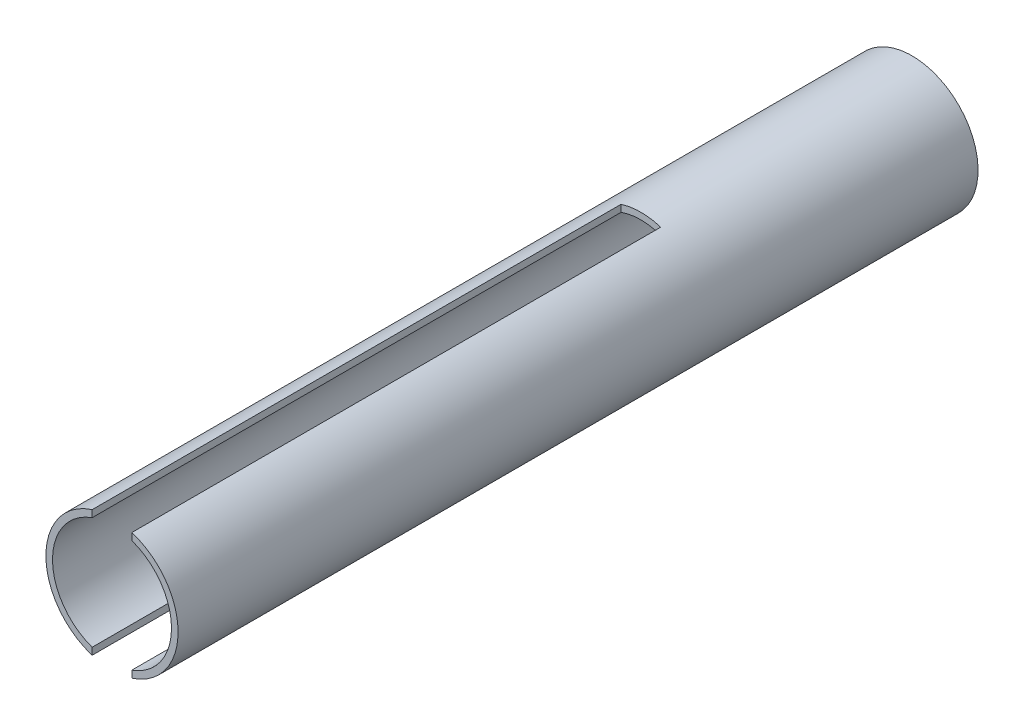
ISO-10303-21;
HEADER;
FILE_DESCRIPTION(('STEP AP214'),'2;1');
FILE_NAME('part.step','',(''),(''),'','','');
FILE_SCHEMA(('AUTOMOTIVE_DESIGN { 1 0 10303 214 1 1 1 1 }'));
ENDSEC;
DATA;
#1=APPLICATION_CONTEXT('core data for automotive mechanical design processes');
#2=APPLICATION_PROTOCOL_DEFINITION('international standard','automotive_design',2000,#1);
#3=PRODUCT_CONTEXT('',#1,'mechanical');
#4=PRODUCT('Part','Part','',(#3));
#5=PRODUCT_RELATED_PRODUCT_CATEGORY('part','',(#4));
#6=PRODUCT_DEFINITION_FORMATION('','',#4);
#7=PRODUCT_DEFINITION_CONTEXT('part definition',#1,'design');
#8=PRODUCT_DEFINITION('design','',#6,#7);
#9=PRODUCT_DEFINITION_SHAPE('','',#8);
#10=(LENGTH_UNIT() NAMED_UNIT(*) SI_UNIT(.MILLI.,.METRE.));
#11=(NAMED_UNIT(*) PLANE_ANGLE_UNIT() SI_UNIT($,.RADIAN.));
#12=(NAMED_UNIT(*) SI_UNIT($,.STERADIAN.) SOLID_ANGLE_UNIT());
#13=UNCERTAINTY_MEASURE_WITH_UNIT(LENGTH_MEASURE(1.E-05),#10,'distance_accuracy_value','');
#14=(GEOMETRIC_REPRESENTATION_CONTEXT(3) GLOBAL_UNCERTAINTY_ASSIGNED_CONTEXT((#13)) GLOBAL_UNIT_ASSIGNED_CONTEXT((#10,
#11,#12)) REPRESENTATION_CONTEXT('',''));
#15=CARTESIAN_POINT('',(0.,0.,0.));
#16=DIRECTION('',(0.,0.,1.));
#17=DIRECTION('',(1.,0.,0.));
#18=AXIS2_PLACEMENT_3D('',#15,#16,#17);
#19=CARTESIAN_POINT('',(0.,0.,-300.));
#20=DIRECTION('',(0.,0.,1.));
#21=DIRECTION('',(1.,0.,0.));
#22=AXIS2_PLACEMENT_3D('',#19,#20,#21);
#23=CYLINDRICAL_SURFACE('',#22,25.);
#24=CARTESIAN_POINT('',(0.,0.,0.));
#25=DIRECTION('',(0.,0.,1.));
#26=DIRECTION('',(1.,0.,0.));
#27=AXIS2_PLACEMENT_3D('',#24,#25,#26);
#28=CIRCLE('',#27,25.);
#29=CARTESIAN_POINT('',(7.5,-23.8484800354236,0.));
#30=VERTEX_POINT('',#29);
#31=CARTESIAN_POINT('',(7.5,23.8484800354236,0.));
#32=VERTEX_POINT('',#31);
#33=EDGE_CURVE('E130',#30,#32,#28,.T.);
#34=ORIENTED_EDGE('',*,*,#33,.F.);
#35=DIRECTION('',(0.,0.,1.));
#36=VECTOR('',#35,1.);
#37=CARTESIAN_POINT('',(7.5,-23.8484800354236,-300.));
#38=LINE('',#37,#36);
#39=CARTESIAN_POINT('',(7.5,-23.8484800354236,-200.));
#40=VERTEX_POINT('',#39);
#41=EDGE_CURVE('E99',#30,#40,#38,.F.);
#42=ORIENTED_EDGE('',*,*,#41,.T.);
#43=CARTESIAN_POINT('',(0.,0.,-200.));
#44=DIRECTION('',(0.,0.,-1.));
#45=DIRECTION('',(-1.,0.,0.));
#46=AXIS2_PLACEMENT_3D('',#43,#44,#45);
#47=CIRCLE('',#46,25.);
#48=CARTESIAN_POINT('',(-7.49999999999999,-23.8484800354236,-200.));
#49=VERTEX_POINT('',#48);
#50=EDGE_CURVE('E169',#49,#40,#47,.F.);
#51=ORIENTED_EDGE('',*,*,#50,.F.);
#52=DIRECTION('',(0.,0.,1.));
#53=VECTOR('',#52,1.);
#54=CARTESIAN_POINT('',(-7.49999999999999,-23.8484800354236,-300.));
#55=LINE('',#54,#53);
#56=CARTESIAN_POINT('',(-7.5,-23.8484800354236,0.));
#57=VERTEX_POINT('',#56);
#58=EDGE_CURVE('E167',#49,#57,#55,.T.);
#59=ORIENTED_EDGE('',*,*,#58,.T.);
#60=CARTESIAN_POINT('',(-7.5,23.8484800354236,0.));
#61=VERTEX_POINT('',#60);
#62=EDGE_CURVE('E126',#61,#57,#28,.T.);
#63=ORIENTED_EDGE('',*,*,#62,.F.);
#64=DIRECTION('',(0.,0.,1.));
#65=VECTOR('',#64,1.);
#66=CARTESIAN_POINT('',(-7.49999999999999,23.8484800354236,-300.));
#67=LINE('',#66,#65);
#68=CARTESIAN_POINT('',(-7.49999999999999,23.8484800354236,-200.));
#69=VERTEX_POINT('',#68);
#70=EDGE_CURVE('E122',#69,#61,#67,.T.);
#71=ORIENTED_EDGE('',*,*,#70,.F.);
#72=CARTESIAN_POINT('',(0.,0.,-200.));
#73=DIRECTION('',(0.,0.,-1.));
#74=DIRECTION('',(-1.,0.,0.));
#75=AXIS2_PLACEMENT_3D('',#72,#73,#74);
#76=CIRCLE('',#75,25.);
#77=CARTESIAN_POINT('',(7.5,23.8484800354236,-200.));
#78=VERTEX_POINT('',#77);
#79=EDGE_CURVE('E162',#78,#69,#76,.F.);
#80=ORIENTED_EDGE('',*,*,#79,.F.);
#81=DIRECTION('',(0.,0.,1.));
#82=VECTOR('',#81,1.);
#83=CARTESIAN_POINT('',(7.5,23.8484800354236,-300.));
#84=LINE('',#83,#82);
#85=EDGE_CURVE('E118',#32,#78,#84,.F.);
#86=ORIENTED_EDGE('',*,*,#85,.F.);
#87=EDGE_LOOP('',(#34,#42,#51,#59,#63,#71,#80,#86));
#88=FACE_BOUND('',#87,.T.);
#89=CARTESIAN_POINT('',(0.,0.,-302.5));
#90=DIRECTION('',(0.,0.,-1.));
#91=DIRECTION('',(-1.,0.,0.));
#92=AXIS2_PLACEMENT_3D('',#89,#90,#91);
#93=CIRCLE('',#92,25.);
#94=CARTESIAN_POINT('',(-25.,0.,-302.5));
#95=VERTEX_POINT('',#94);
#96=EDGE_CURVE('E104',#95,#95,#93,.T.);
#97=ORIENTED_EDGE('',*,*,#96,.F.);
#98=EDGE_LOOP('',(#97));
#99=FACE_BOUND('',#98,.T.);
#100=ADVANCED_FACE('F32',(#88,#99),#23,.T.);
#101=CARTESIAN_POINT('',(0.,0.,0.));
#102=DIRECTION('',(0.,0.,1.));
#103=DIRECTION('',(1.,0.,0.));
#104=AXIS2_PLACEMENT_3D('',#101,#102,#103);
#105=PLANE('',#104);
#106=CARTESIAN_POINT('',(0.,0.,0.));
#107=DIRECTION('',(0.,0.,1.));
#108=DIRECTION('',(1.,0.,0.));
#109=AXIS2_PLACEMENT_3D('',#106,#107,#108);
#110=CIRCLE('',#109,22.5);
#111=CARTESIAN_POINT('',(7.5,-21.2132034355964,0.));
#112=VERTEX_POINT('',#111);
#113=CARTESIAN_POINT('',(7.5,21.2132034355964,0.));
#114=VERTEX_POINT('',#113);
#115=EDGE_CURVE('E109',#112,#114,#110,.T.);
#116=ORIENTED_EDGE('',*,*,#115,.F.);
#117=DIRECTION('',(0.,-1.,0.));
#118=VECTOR('',#117,1.);
#119=CARTESIAN_POINT('',(7.5,-19.3596308792038,0.));
#120=LINE('',#119,#118);
#121=EDGE_CURVE('E94',#112,#30,#120,.T.);
#122=ORIENTED_EDGE('',*,*,#121,.T.);
#123=ORIENTED_EDGE('',*,*,#33,.T.);
#124=DIRECTION('',(0.,1.,0.));
#125=VECTOR('',#124,1.);
#126=CARTESIAN_POINT('',(7.5,19.3596308792038,0.));
#127=LINE('',#126,#125);
#128=EDGE_CURVE('E116',#114,#32,#127,.T.);
#129=ORIENTED_EDGE('',*,*,#128,.F.);
#130=EDGE_LOOP('',(#116,#122,#123,#129));
#131=FACE_BOUND('',#130,.T.);
#132=ADVANCED_FACE('F114',(#131),#105,.T.);
#133=ORIENTED_EDGE('',*,*,#62,.T.);
#134=DIRECTION('',(0.,1.,0.));
#135=VECTOR('',#134,1.);
#136=CARTESIAN_POINT('',(-7.5,-19.3596308792038,0.));
#137=LINE('',#136,#135);
#138=CARTESIAN_POINT('',(-7.49999999999999,-21.2132034355964,0.));
#139=VERTEX_POINT('',#138);
#140=EDGE_CURVE('E103',#57,#139,#137,.T.);
#141=ORIENTED_EDGE('',*,*,#140,.T.);
#142=CARTESIAN_POINT('',(-7.49999999999999,21.2132034355964,0.));
#143=VERTEX_POINT('',#142);
#144=EDGE_CURVE('E117',#143,#139,#110,.T.);
#145=ORIENTED_EDGE('',*,*,#144,.F.);
#146=DIRECTION('',(0.,-1.,0.));
#147=VECTOR('',#146,1.);
#148=CARTESIAN_POINT('',(-7.5,19.3596308792038,0.));
#149=LINE('',#148,#147);
#150=EDGE_CURVE('E154',#61,#143,#149,.T.);
#151=ORIENTED_EDGE('',*,*,#150,.F.);
#152=EDGE_LOOP('',(#133,#141,#145,#151));
#153=FACE_BOUND('',#152,.T.);
#154=ADVANCED_FACE('F147',(#153),#105,.T.);
#155=CARTESIAN_POINT('',(0.,0.,-300.));
#156=DIRECTION('',(0.,0.,1.));
#157=DIRECTION('',(1.,0.,0.));
#158=AXIS2_PLACEMENT_3D('',#155,#156,#157);
#159=CYLINDRICAL_SURFACE('',#158,22.5);
#160=CARTESIAN_POINT('',(0.,0.,-300.));
#161=DIRECTION('',(0.,0.,1.));
#162=DIRECTION('',(1.,0.,0.));
#163=AXIS2_PLACEMENT_3D('',#160,#161,#162);
#164=CIRCLE('',#163,22.5);
#165=CARTESIAN_POINT('',(22.5,0.,-300.));
#166=VERTEX_POINT('',#165);
#167=EDGE_CURVE('E121',#166,#166,#164,.T.);
#168=ORIENTED_EDGE('',*,*,#167,.F.);
#169=EDGE_LOOP('',(#168));
#170=FACE_BOUND('',#169,.T.);
#171=DIRECTION('',(0.,0.,1.));
#172=VECTOR('',#171,1.);
#173=CARTESIAN_POINT('',(7.5,-21.2132034355964,-300.));
#174=LINE('',#173,#172);
#175=CARTESIAN_POINT('',(7.5,-21.2132034355964,-200.));
#176=VERTEX_POINT('',#175);
#177=EDGE_CURVE('E11',#112,#176,#174,.F.);
#178=ORIENTED_EDGE('',*,*,#177,.F.);
#179=ORIENTED_EDGE('',*,*,#115,.T.);
#180=DIRECTION('',(0.,0.,1.));
#181=VECTOR('',#180,1.);
#182=CARTESIAN_POINT('',(7.5,21.2132034355964,-300.));
#183=LINE('',#182,#181);
#184=CARTESIAN_POINT('',(7.5,21.2132034355964,-200.));
#185=VERTEX_POINT('',#184);
#186=EDGE_CURVE('E136',#114,#185,#183,.F.);
#187=ORIENTED_EDGE('',*,*,#186,.T.);
#188=CARTESIAN_POINT('',(0.,0.,-200.));
#189=DIRECTION('',(0.,0.,-1.));
#190=DIRECTION('',(-1.,0.,0.));
#191=AXIS2_PLACEMENT_3D('',#188,#189,#190);
#192=CIRCLE('',#191,22.5);
#193=CARTESIAN_POINT('',(-7.49999999999999,21.2132034355964,-200.));
#194=VERTEX_POINT('',#193);
#195=EDGE_CURVE('E129',#185,#194,#192,.F.);
#196=ORIENTED_EDGE('',*,*,#195,.T.);
#197=DIRECTION('',(0.,0.,1.));
#198=VECTOR('',#197,1.);
#199=CARTESIAN_POINT('',(-7.49999999999999,21.2132034355964,-300.));
#200=LINE('',#199,#198);
#201=EDGE_CURVE('E133',#194,#143,#200,.T.);
#202=ORIENTED_EDGE('',*,*,#201,.T.);
#203=ORIENTED_EDGE('',*,*,#144,.T.);
#204=DIRECTION('',(0.,0.,1.));
#205=VECTOR('',#204,1.);
#206=CARTESIAN_POINT('',(-7.49999999999999,-21.2132034355964,-300.));
#207=LINE('',#206,#205);
#208=CARTESIAN_POINT('',(-7.49999999999999,-21.2132034355964,-200.));
#209=VERTEX_POINT('',#208);
#210=EDGE_CURVE('E39',#209,#139,#207,.T.);
#211=ORIENTED_EDGE('',*,*,#210,.F.);
#212=CARTESIAN_POINT('',(0.,0.,-200.));
#213=DIRECTION('',(0.,0.,-1.));
#214=DIRECTION('',(-1.,0.,0.));
#215=AXIS2_PLACEMENT_3D('',#212,#213,#214);
#216=CIRCLE('',#215,22.5);
#217=EDGE_CURVE('E112',#209,#176,#216,.F.);
#218=ORIENTED_EDGE('',*,*,#217,.T.);
#219=EDGE_LOOP('',(#178,#179,#187,#196,#202,#203,#211,#218));
#220=FACE_BOUND('',#219,.T.);
#221=ADVANCED_FACE('F107',(#170,#220),#159,.F.);
#222=CARTESIAN_POINT('',(7.5,19.3596308792038,-200.));
#223=DIRECTION('',(1.,0.,0.));
#224=DIRECTION('',(0.,0.,-1.));
#225=AXIS2_PLACEMENT_3D('',#222,#223,#224);
#226=PLANE('',#225);
#227=ORIENTED_EDGE('',*,*,#85,.T.);
#228=DIRECTION('',(0.,1.,0.));
#229=VECTOR('',#228,1.);
#230=CARTESIAN_POINT('',(7.5,19.3596308792038,-200.));
#231=LINE('',#230,#229);
#232=EDGE_CURVE('E155',#185,#78,#231,.T.);
#233=ORIENTED_EDGE('',*,*,#232,.F.);
#234=ORIENTED_EDGE('',*,*,#186,.F.);
#235=ORIENTED_EDGE('',*,*,#128,.T.);
#236=EDGE_LOOP('',(#227,#233,#234,#235));
#237=FACE_BOUND('',#236,.T.);
#238=ADVANCED_FACE('F191',(#237),#226,.F.);
#239=CARTESIAN_POINT('',(-7.5,19.3596308792038,-200.));
#240=DIRECTION('',(-1.,0.,0.));
#241=DIRECTION('',(0.,0.,1.));
#242=AXIS2_PLACEMENT_3D('',#239,#240,#241);
#243=PLANE('',#242);
#244=ORIENTED_EDGE('',*,*,#70,.T.);
#245=ORIENTED_EDGE('',*,*,#150,.T.);
#246=ORIENTED_EDGE('',*,*,#201,.F.);
#247=DIRECTION('',(0.,-1.,0.));
#248=VECTOR('',#247,1.);
#249=CARTESIAN_POINT('',(-7.5,19.3596308792038,-200.));
#250=LINE('',#249,#248);
#251=EDGE_CURVE('E53',#69,#194,#250,.T.);
#252=ORIENTED_EDGE('',*,*,#251,.F.);
#253=EDGE_LOOP('',(#244,#245,#246,#252));
#254=FACE_BOUND('',#253,.T.);
#255=ADVANCED_FACE('F152',(#254),#243,.F.);
#256=CARTESIAN_POINT('',(0.,0.,-200.));
#257=DIRECTION('',(0.,0.,-1.));
#258=DIRECTION('',(-1.,0.,0.));
#259=AXIS2_PLACEMENT_3D('',#256,#257,#258);
#260=PLANE('',#259);
#261=ORIENTED_EDGE('',*,*,#79,.T.);
#262=ORIENTED_EDGE('',*,*,#251,.T.);
#263=ORIENTED_EDGE('',*,*,#195,.F.);
#264=ORIENTED_EDGE('',*,*,#232,.T.);
#265=EDGE_LOOP('',(#261,#262,#263,#264));
#266=FACE_BOUND('',#265,.T.);
#267=ADVANCED_FACE('F202',(#266),#260,.F.);
#268=CARTESIAN_POINT('',(7.5,-19.3596308792038,-200.));
#269=DIRECTION('',(-1.,0.,0.));
#270=DIRECTION('',(0.,0.,1.));
#271=AXIS2_PLACEMENT_3D('',#268,#269,#270);
#272=PLANE('',#271);
#273=ORIENTED_EDGE('',*,*,#121,.F.);
#274=ORIENTED_EDGE('',*,*,#177,.T.);
#275=DIRECTION('',(0.,-1.,0.));
#276=VECTOR('',#275,1.);
#277=CARTESIAN_POINT('',(7.5,-19.3596308792038,-200.));
#278=LINE('',#277,#276);
#279=EDGE_CURVE('E46',#176,#40,#278,.T.);
#280=ORIENTED_EDGE('',*,*,#279,.T.);
#281=ORIENTED_EDGE('',*,*,#41,.F.);
#282=EDGE_LOOP('',(#273,#274,#280,#281));
#283=FACE_BOUND('',#282,.T.);
#284=ADVANCED_FACE('F96',(#283),#272,.T.);
#285=CARTESIAN_POINT('',(-7.5,-19.3596308792038,-200.));
#286=DIRECTION('',(1.,0.,0.));
#287=DIRECTION('',(0.,0.,-1.));
#288=AXIS2_PLACEMENT_3D('',#285,#286,#287);
#289=PLANE('',#288);
#290=DIRECTION('',(0.,1.,0.));
#291=VECTOR('',#290,1.);
#292=CARTESIAN_POINT('',(-7.5,-19.3596308792038,-200.));
#293=LINE('',#292,#291);
#294=EDGE_CURVE('E144',#49,#209,#293,.T.);
#295=ORIENTED_EDGE('',*,*,#294,.T.);
#296=ORIENTED_EDGE('',*,*,#210,.T.);
#297=ORIENTED_EDGE('',*,*,#140,.F.);
#298=ORIENTED_EDGE('',*,*,#58,.F.);
#299=EDGE_LOOP('',(#295,#296,#297,#298));
#300=FACE_BOUND('',#299,.T.);
#301=ADVANCED_FACE('F141',(#300),#289,.T.);
#302=CARTESIAN_POINT('',(0.,0.,-200.));
#303=DIRECTION('',(0.,0.,-1.));
#304=DIRECTION('',(-1.,0.,0.));
#305=AXIS2_PLACEMENT_3D('',#302,#303,#304);
#306=PLANE('',#305);
#307=ORIENTED_EDGE('',*,*,#50,.T.);
#308=ORIENTED_EDGE('',*,*,#279,.F.);
#309=ORIENTED_EDGE('',*,*,#217,.F.);
#310=ORIENTED_EDGE('',*,*,#294,.F.);
#311=EDGE_LOOP('',(#307,#308,#309,#310));
#312=FACE_BOUND('',#311,.T.);
#313=ADVANCED_FACE('F209',(#312),#306,.F.);
#314=CARTESIAN_POINT('',(0.,0.,-302.5));
#315=DIRECTION('',(0.,0.,-1.));
#316=DIRECTION('',(-1.,0.,0.));
#317=AXIS2_PLACEMENT_3D('',#314,#315,#316);
#318=PLANE('',#317);
#319=ORIENTED_EDGE('',*,*,#96,.T.);
#320=EDGE_LOOP('',(#319));
#321=FACE_BOUND('',#320,.T.);
#322=ADVANCED_FACE('F176',(#321),#318,.T.);
#323=CARTESIAN_POINT('',(0.,0.,-300.));
#324=DIRECTION('',(0.,0.,-1.));
#325=DIRECTION('',(-1.,0.,0.));
#326=AXIS2_PLACEMENT_3D('',#323,#324,#325);
#327=PLANE('',#326);
#328=ORIENTED_EDGE('',*,*,#167,.T.);
#329=EDGE_LOOP('',(#328));
#330=FACE_BOUND('',#329,.T.);
#331=ADVANCED_FACE('F188',(#330),#327,.F.);
#332=CLOSED_SHELL('',(#100,#132,#154,#221,#238,#255,#267,#284,#301,#313,#322,#331));
#333=MANIFOLD_SOLID_BREP('B2',#332);
#334=ADVANCED_BREP_SHAPE_REPRESENTATION('',(#18,#333),#14);
#335=SHAPE_DEFINITION_REPRESENTATION(#9,#334);
ENDSEC;
END-ISO-10303-21;
